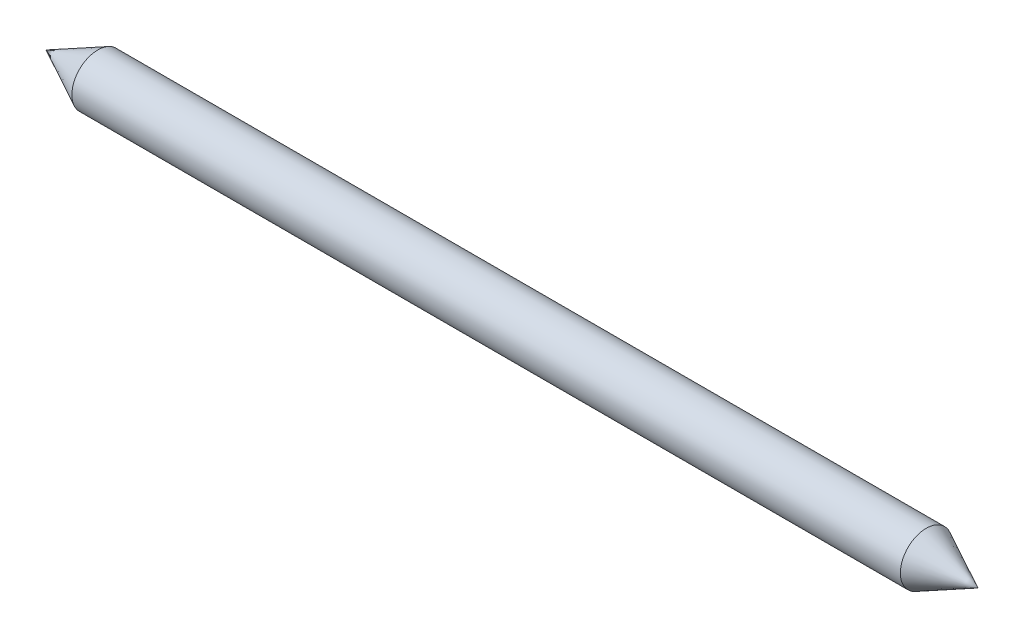
ISO-10303-21;
HEADER;
FILE_DESCRIPTION(('STEP AP214'),'2;1');
FILE_NAME('part.step','',(''),(''),'','','');
FILE_SCHEMA(('AUTOMOTIVE_DESIGN { 1 0 10303 214 1 1 1 1 }'));
ENDSEC;
DATA;
#1=APPLICATION_CONTEXT('core data for automotive mechanical design processes');
#2=APPLICATION_PROTOCOL_DEFINITION('international standard','automotive_design',2000,#1);
#3=PRODUCT_CONTEXT('',#1,'mechanical');
#4=PRODUCT('Part','Part','',(#3));
#5=PRODUCT_RELATED_PRODUCT_CATEGORY('part','',(#4));
#6=PRODUCT_DEFINITION_FORMATION('','',#4);
#7=PRODUCT_DEFINITION_CONTEXT('part definition',#1,'design');
#8=PRODUCT_DEFINITION('design','',#6,#7);
#9=PRODUCT_DEFINITION_SHAPE('','',#8);
#10=(LENGTH_UNIT() NAMED_UNIT(*) SI_UNIT(.MILLI.,.METRE.));
#11=(NAMED_UNIT(*) PLANE_ANGLE_UNIT() SI_UNIT($,.RADIAN.));
#12=(NAMED_UNIT(*) SI_UNIT($,.STERADIAN.) SOLID_ANGLE_UNIT());
#13=UNCERTAINTY_MEASURE_WITH_UNIT(LENGTH_MEASURE(1.E-05),#10,'distance_accuracy_value','');
#14=(GEOMETRIC_REPRESENTATION_CONTEXT(3) GLOBAL_UNCERTAINTY_ASSIGNED_CONTEXT((#13)) GLOBAL_UNIT_ASSIGNED_CONTEXT((#10,
#11,#12)) REPRESENTATION_CONTEXT('',''));
#15=CARTESIAN_POINT('',(0.,0.,0.));
#16=DIRECTION('',(0.,0.,1.));
#17=DIRECTION('',(1.,0.,0.));
#18=AXIS2_PLACEMENT_3D('',#15,#16,#17);
#19=CARTESIAN_POINT('',(-203.2,0.,0.));
#20=DIRECTION('',(1.,0.,0.));
#21=DIRECTION('',(0.,0.,-1.));
#22=AXIS2_PLACEMENT_3D('',#19,#20,#21);
#23=CONICAL_SURFACE('',#22,12.6999999999999,0.463647609000804);
#24=CARTESIAN_POINT('',(-228.6,0.,0.));
#25=VERTEX_POINT('',#24);
#26=VERTEX_LOOP('',#25);
#27=FACE_BOUND('',#26,.T.);
#28=CARTESIAN_POINT('',(-203.2,0.,0.));
#29=DIRECTION('',(-1.,0.,0.));
#30=DIRECTION('',(0.,0.,1.));
#31=AXIS2_PLACEMENT_3D('',#28,#29,#30);
#32=CIRCLE('',#31,12.6999999999999);
#33=CARTESIAN_POINT('',(-203.2,0.,12.6999999999999));
#34=VERTEX_POINT('',#33);
#35=EDGE_CURVE('E11',#34,#34,#32,.T.);
#36=ORIENTED_EDGE('',*,*,#35,.T.);
#37=EDGE_LOOP('',(#36));
#38=FACE_BOUND('',#37,.T.);
#39=ADVANCED_FACE('F45',(#27,#38),#23,.T.);
#40=CARTESIAN_POINT('',(-228.6,0.,0.));
#41=DIRECTION('',(-1.,0.,0.));
#42=DIRECTION('',(0.,0.,1.));
#43=AXIS2_PLACEMENT_3D('',#40,#41,#42);
#44=CYLINDRICAL_SURFACE('',#43,12.6999999999999);
#45=ORIENTED_EDGE('',*,*,#35,.F.);
#46=EDGE_LOOP('',(#45));
#47=FACE_BOUND('',#46,.T.);
#48=CARTESIAN_POINT('',(203.2,0.,0.));
#49=DIRECTION('',(-1.,0.,0.));
#50=DIRECTION('',(0.,0.,1.));
#51=AXIS2_PLACEMENT_3D('',#48,#49,#50);
#52=CIRCLE('',#51,12.6999999999999);
#53=CARTESIAN_POINT('',(203.2,0.,12.6999999999999));
#54=VERTEX_POINT('',#53);
#55=EDGE_CURVE('E53',#54,#54,#52,.T.);
#56=ORIENTED_EDGE('',*,*,#55,.T.);
#57=EDGE_LOOP('',(#56));
#58=FACE_BOUND('',#57,.T.);
#59=ADVANCED_FACE('F61',(#47,#58),#44,.T.);
#60=CARTESIAN_POINT('',(228.6,0.,0.));
#61=DIRECTION('',(-1.,0.,0.));
#62=DIRECTION('',(0.,0.,1.));
#63=AXIS2_PLACEMENT_3D('',#60,#61,#62);
#64=CONICAL_SURFACE('',#63,0.,0.463647609000804);
#65=ORIENTED_EDGE('',*,*,#55,.F.);
#66=EDGE_LOOP('',(#65));
#67=FACE_BOUND('',#66,.T.);
#68=CARTESIAN_POINT('',(228.6,0.,0.));
#69=VERTEX_POINT('',#68);
#70=VERTEX_LOOP('',#69);
#71=FACE_BOUND('',#70,.T.);
#72=ADVANCED_FACE('F66',(#67,#71),#64,.T.);
#73=CLOSED_SHELL('',(#39,#59,#72));
#74=MANIFOLD_SOLID_BREP('B2',#73);
#75=ADVANCED_BREP_SHAPE_REPRESENTATION('',(#18,#74),#14);
#76=SHAPE_DEFINITION_REPRESENTATION(#9,#75);
ENDSEC;
END-ISO-10303-21;
